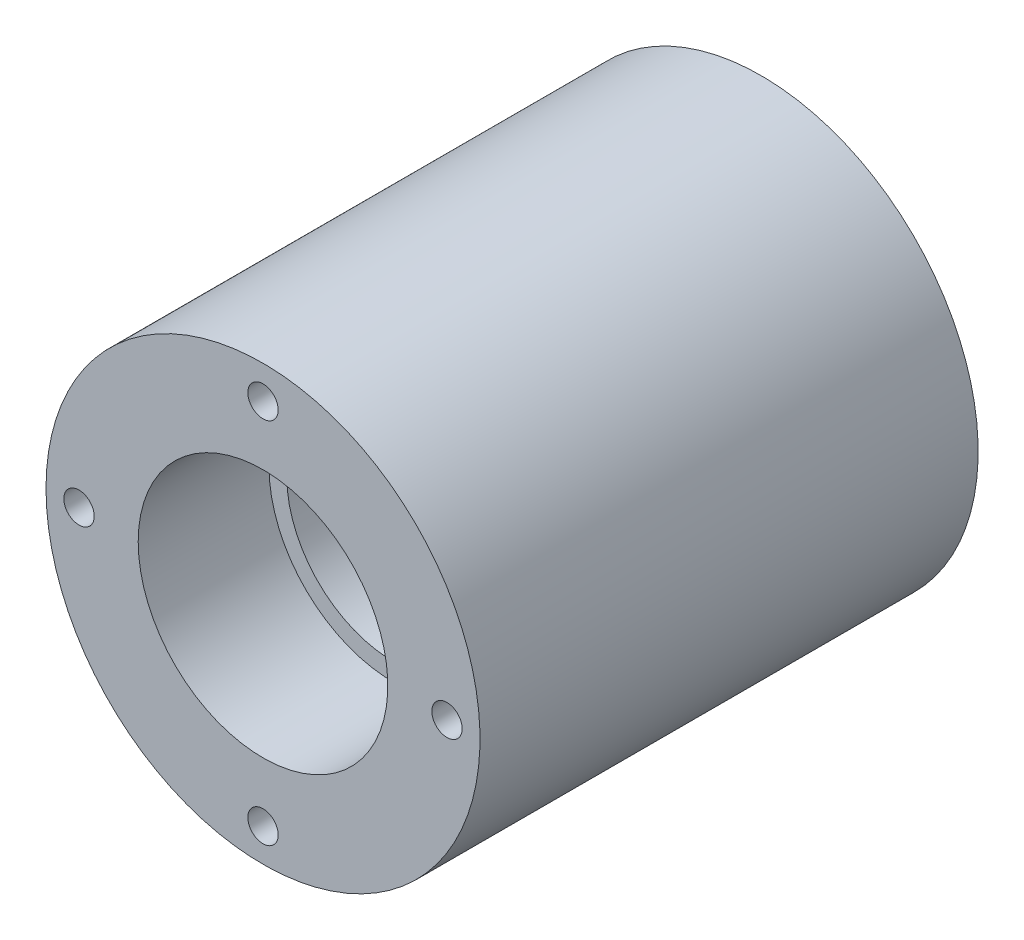
ISO-10303-21;
HEADER;
FILE_DESCRIPTION(('STEP AP214'),'2;1');
FILE_NAME('part.step','',(''),(''),'','','');
FILE_SCHEMA(('AUTOMOTIVE_DESIGN { 1 0 10303 214 1 1 1 1 }'));
ENDSEC;
DATA;
#1=APPLICATION_CONTEXT('core data for automotive mechanical design processes');
#2=APPLICATION_PROTOCOL_DEFINITION('international standard','automotive_design',2000,#1);
#3=PRODUCT_CONTEXT('',#1,'mechanical');
#4=PRODUCT('Part','Part','',(#3));
#5=PRODUCT_RELATED_PRODUCT_CATEGORY('part','',(#4));
#6=PRODUCT_DEFINITION_FORMATION('','',#4);
#7=PRODUCT_DEFINITION_CONTEXT('part definition',#1,'design');
#8=PRODUCT_DEFINITION('design','',#6,#7);
#9=PRODUCT_DEFINITION_SHAPE('','',#8);
#10=(LENGTH_UNIT() NAMED_UNIT(*) SI_UNIT(.MILLI.,.METRE.));
#11=(NAMED_UNIT(*) PLANE_ANGLE_UNIT() SI_UNIT($,.RADIAN.));
#12=(NAMED_UNIT(*) SI_UNIT($,.STERADIAN.) SOLID_ANGLE_UNIT());
#13=UNCERTAINTY_MEASURE_WITH_UNIT(LENGTH_MEASURE(1.E-05),#10,'distance_accuracy_value','');
#14=(GEOMETRIC_REPRESENTATION_CONTEXT(3) GLOBAL_UNCERTAINTY_ASSIGNED_CONTEXT((#13)) GLOBAL_UNIT_ASSIGNED_CONTEXT((#10,
#11,#12)) REPRESENTATION_CONTEXT('',''));
#15=CARTESIAN_POINT('',(0.,0.,0.));
#16=DIRECTION('',(0.,0.,1.));
#17=DIRECTION('',(1.,0.,0.));
#18=AXIS2_PLACEMENT_3D('',#15,#16,#17);
#19=CARTESIAN_POINT('',(0.,0.,-141.552259200278));
#20=DIRECTION('',(0.,0.,-1.));
#21=DIRECTION('',(-1.,0.,0.));
#22=AXIS2_PLACEMENT_3D('',#19,#20,#21);
#23=CYLINDRICAL_SURFACE('',#22,21.);
#24=CARTESIAN_POINT('',(0.,0.,0.));
#25=DIRECTION('',(0.,0.,-1.));
#26=DIRECTION('',(-1.,0.,0.));
#27=AXIS2_PLACEMENT_3D('',#24,#25,#26);
#28=CIRCLE('',#27,21.);
#29=CARTESIAN_POINT('',(-21.,0.,0.));
#30=VERTEX_POINT('',#29);
#31=EDGE_CURVE('E124',#30,#30,#28,.T.);
#32=ORIENTED_EDGE('',*,*,#31,.F.);
#33=EDGE_LOOP('',(#32));
#34=FACE_BOUND('',#33,.T.);
#35=CARTESIAN_POINT('',(0.,0.,-22.));
#36=DIRECTION('',(0.,0.,-1.));
#37=DIRECTION('',(-1.,0.,0.));
#38=AXIS2_PLACEMENT_3D('',#35,#36,#37);
#39=CIRCLE('',#38,21.);
#40=CARTESIAN_POINT('',(-21.,0.,-22.));
#41=VERTEX_POINT('',#40);
#42=EDGE_CURVE('E11',#41,#41,#39,.T.);
#43=ORIENTED_EDGE('',*,*,#42,.T.);
#44=EDGE_LOOP('',(#43));
#45=FACE_BOUND('',#44,.T.);
#46=ADVANCED_FACE('F35',(#34,#45),#23,.F.);
#47=CARTESIAN_POINT('',(0.,0.,-22.));
#48=DIRECTION('',(0.,0.,-1.));
#49=DIRECTION('',(-1.,0.,0.));
#50=AXIS2_PLACEMENT_3D('',#47,#48,#49);
#51=PLANE('',#50);
#52=ORIENTED_EDGE('',*,*,#42,.F.);
#53=EDGE_LOOP('',(#52));
#54=FACE_BOUND('',#53,.T.);
#55=CARTESIAN_POINT('',(0.,0.,-22.));
#56=DIRECTION('',(0.,0.,-1.));
#57=DIRECTION('',(-1.,0.,0.));
#58=AXIS2_PLACEMENT_3D('',#55,#56,#57);
#59=CIRCLE('',#58,18.);
#60=CARTESIAN_POINT('',(-18.,0.,-22.));
#61=VERTEX_POINT('',#60);
#62=EDGE_CURVE('E42',#61,#61,#59,.T.);
#63=ORIENTED_EDGE('',*,*,#62,.T.);
#64=EDGE_LOOP('',(#63));
#65=FACE_BOUND('',#64,.T.);
#66=ADVANCED_FACE('F144',(#54,#65),#51,.F.);
#67=CARTESIAN_POINT('',(0.,0.,-141.552259200278));
#68=DIRECTION('',(0.,0.,-1.));
#69=DIRECTION('',(-1.,0.,0.));
#70=AXIS2_PLACEMENT_3D('',#67,#68,#69);
#71=CYLINDRICAL_SURFACE('',#70,18.);
#72=ORIENTED_EDGE('',*,*,#62,.F.);
#73=EDGE_LOOP('',(#72));
#74=FACE_BOUND('',#73,.T.);
#75=CARTESIAN_POINT('',(0.,0.,-55.945));
#76=DIRECTION('',(0.,0.,-1.));
#77=DIRECTION('',(-1.,0.,0.));
#78=AXIS2_PLACEMENT_3D('',#75,#76,#77);
#79=CIRCLE('',#78,18.);
#80=CARTESIAN_POINT('',(-18.,0.,-55.945));
#81=VERTEX_POINT('',#80);
#82=EDGE_CURVE('E139',#81,#81,#79,.T.);
#83=ORIENTED_EDGE('',*,*,#82,.T.);
#84=EDGE_LOOP('',(#83));
#85=FACE_BOUND('',#84,.T.);
#86=ADVANCED_FACE('F146',(#74,#85),#71,.F.);
#87=CARTESIAN_POINT('',(0.,0.,-55.945));
#88=DIRECTION('',(0.,0.,1.));
#89=DIRECTION('',(1.,0.,0.));
#90=AXIS2_PLACEMENT_3D('',#87,#88,#89);
#91=PLANE('',#90);
#92=ORIENTED_EDGE('',*,*,#82,.F.);
#93=EDGE_LOOP('',(#92));
#94=FACE_BOUND('',#93,.T.);
#95=CARTESIAN_POINT('',(0.,0.,-55.945));
#96=DIRECTION('',(0.,0.,-1.));
#97=DIRECTION('',(-1.,0.,0.));
#98=AXIS2_PLACEMENT_3D('',#95,#96,#97);
#99=CIRCLE('',#98,21.);
#100=CARTESIAN_POINT('',(-21.,0.,-55.945));
#101=VERTEX_POINT('',#100);
#102=EDGE_CURVE('E136',#101,#101,#99,.T.);
#103=ORIENTED_EDGE('',*,*,#102,.T.);
#104=EDGE_LOOP('',(#103));
#105=FACE_BOUND('',#104,.T.);
#106=ADVANCED_FACE('F149',(#94,#105),#91,.F.);
#107=CARTESIAN_POINT('',(0.,0.,-141.552259200278));
#108=DIRECTION('',(0.,0.,-1.));
#109=DIRECTION('',(-1.,0.,0.));
#110=AXIS2_PLACEMENT_3D('',#107,#108,#109);
#111=CYLINDRICAL_SURFACE('',#110,21.);
#112=ORIENTED_EDGE('',*,*,#102,.F.);
#113=EDGE_LOOP('',(#112));
#114=FACE_BOUND('',#113,.T.);
#115=CARTESIAN_POINT('',(0.,0.,-83.82));
#116=DIRECTION('',(0.,0.,-1.));
#117=DIRECTION('',(-1.,0.,0.));
#118=AXIS2_PLACEMENT_3D('',#115,#116,#117);
#119=CIRCLE('',#118,21.);
#120=CARTESIAN_POINT('',(-21.,0.,-83.82));
#121=VERTEX_POINT('',#120);
#122=EDGE_CURVE('E133',#121,#121,#119,.T.);
#123=ORIENTED_EDGE('',*,*,#122,.T.);
#124=EDGE_LOOP('',(#123));
#125=FACE_BOUND('',#124,.T.);
#126=ADVANCED_FACE('F155',(#114,#125),#111,.F.);
#127=CARTESIAN_POINT('',(0.,0.,-83.82));
#128=DIRECTION('',(0.,0.,1.));
#129=DIRECTION('',(1.,0.,0.));
#130=AXIS2_PLACEMENT_3D('',#127,#128,#129);
#131=PLANE('',#130);
#132=CARTESIAN_POINT('',(0.,30.95752,-83.82));
#133=DIRECTION('',(0.,0.,-1.));
#134=DIRECTION('',(-1.,0.,0.));
#135=AXIS2_PLACEMENT_3D('',#132,#133,#134);
#136=CIRCLE('',#135,2.55269999999999);
#137=CARTESIAN_POINT('',(-2.55269999999999,30.95752,-83.82));
#138=VERTEX_POINT('',#137);
#139=EDGE_CURVE('E78',#138,#138,#136,.T.);
#140=ORIENTED_EDGE('',*,*,#139,.F.);
#141=EDGE_LOOP('',(#140));
#142=FACE_BOUND('',#141,.T.);
#143=CARTESIAN_POINT('',(30.95752,0.,-83.82));
#144=DIRECTION('',(0.,0.,-1.));
#145=DIRECTION('',(-1.,0.,0.));
#146=AXIS2_PLACEMENT_3D('',#143,#144,#145);
#147=CIRCLE('',#146,2.55269999999999);
#148=CARTESIAN_POINT('',(28.40482,0.,-83.82));
#149=VERTEX_POINT('',#148);
#150=EDGE_CURVE('E77',#149,#149,#147,.T.);
#151=ORIENTED_EDGE('',*,*,#150,.F.);
#152=EDGE_LOOP('',(#151));
#153=FACE_BOUND('',#152,.T.);
#154=CARTESIAN_POINT('',(0.,-30.95752,-83.82));
#155=DIRECTION('',(0.,0.,-1.));
#156=DIRECTION('',(-1.,0.,0.));
#157=AXIS2_PLACEMENT_3D('',#154,#155,#156);
#158=CIRCLE('',#157,2.55269999999999);
#159=CARTESIAN_POINT('',(-2.55269999999999,-30.95752,-83.82));
#160=VERTEX_POINT('',#159);
#161=EDGE_CURVE('E88',#160,#160,#158,.T.);
#162=ORIENTED_EDGE('',*,*,#161,.F.);
#163=EDGE_LOOP('',(#162));
#164=FACE_BOUND('',#163,.T.);
#165=CARTESIAN_POINT('',(-30.95752,0.,-83.82));
#166=DIRECTION('',(0.,0.,-1.));
#167=DIRECTION('',(-1.,0.,0.));
#168=AXIS2_PLACEMENT_3D('',#165,#166,#167);
#169=CIRCLE('',#168,2.55269999999999);
#170=CARTESIAN_POINT('',(-33.51022,0.,-83.82));
#171=VERTEX_POINT('',#170);
#172=EDGE_CURVE('E94',#171,#171,#169,.T.);
#173=ORIENTED_EDGE('',*,*,#172,.F.);
#174=EDGE_LOOP('',(#173));
#175=FACE_BOUND('',#174,.T.);
#176=ORIENTED_EDGE('',*,*,#122,.F.);
#177=EDGE_LOOP('',(#176));
#178=FACE_BOUND('',#177,.T.);
#179=CARTESIAN_POINT('',(0.,0.,-83.82));
#180=DIRECTION('',(0.,0.,-1.));
#181=DIRECTION('',(-1.,0.,0.));
#182=AXIS2_PLACEMENT_3D('',#179,#180,#181);
#183=CIRCLE('',#182,36.5125);
#184=CARTESIAN_POINT('',(-36.5125,0.,-83.82));
#185=VERTEX_POINT('',#184);
#186=EDGE_CURVE('E130',#185,#185,#183,.T.);
#187=ORIENTED_EDGE('',*,*,#186,.T.);
#188=EDGE_LOOP('',(#187));
#189=FACE_BOUND('',#188,.T.);
#190=ADVANCED_FACE('F161',(#142,#153,#164,#175,#178,#189),#131,.F.);
#191=CARTESIAN_POINT('',(0.,0.,-141.552259200278));
#192=DIRECTION('',(0.,0.,-1.));
#193=DIRECTION('',(-1.,0.,0.));
#194=AXIS2_PLACEMENT_3D('',#191,#192,#193);
#195=CYLINDRICAL_SURFACE('',#194,36.5125);
#196=CARTESIAN_POINT('',(0.,0.,0.));
#197=DIRECTION('',(0.,0.,-1.));
#198=DIRECTION('',(-1.,0.,0.));
#199=AXIS2_PLACEMENT_3D('',#196,#197,#198);
#200=CIRCLE('',#199,36.5125);
#201=CARTESIAN_POINT('',(-36.5125,0.,0.));
#202=VERTEX_POINT('',#201);
#203=EDGE_CURVE('E127',#202,#202,#200,.T.);
#204=ORIENTED_EDGE('',*,*,#203,.T.);
#205=EDGE_LOOP('',(#204));
#206=FACE_BOUND('',#205,.T.);
#207=ORIENTED_EDGE('',*,*,#186,.F.);
#208=EDGE_LOOP('',(#207));
#209=FACE_BOUND('',#208,.T.);
#210=ADVANCED_FACE('F167',(#206,#209),#195,.T.);
#211=CARTESIAN_POINT('',(0.,0.,0.));
#212=DIRECTION('',(0.,0.,1.));
#213=DIRECTION('',(1.,0.,0.));
#214=AXIS2_PLACEMENT_3D('',#211,#212,#213);
#215=PLANE('',#214);
#216=CARTESIAN_POINT('',(0.,30.95752,0.));
#217=DIRECTION('',(0.,0.,1.));
#218=DIRECTION('',(1.,0.,0.));
#219=AXIS2_PLACEMENT_3D('',#216,#217,#218);
#220=CIRCLE('',#219,2.55269999999999);
#221=CARTESIAN_POINT('',(2.55269999999999,30.95752,0.));
#222=VERTEX_POINT('',#221);
#223=EDGE_CURVE('E100',#222,#222,#220,.T.);
#224=ORIENTED_EDGE('',*,*,#223,.F.);
#225=EDGE_LOOP('',(#224));
#226=FACE_BOUND('',#225,.T.);
#227=CARTESIAN_POINT('',(30.95752,0.,0.));
#228=DIRECTION('',(0.,0.,1.));
#229=DIRECTION('',(1.,0.,0.));
#230=AXIS2_PLACEMENT_3D('',#227,#228,#229);
#231=CIRCLE('',#230,2.55269999999999);
#232=CARTESIAN_POINT('',(33.51022,0.,0.));
#233=VERTEX_POINT('',#232);
#234=EDGE_CURVE('E106',#233,#233,#231,.T.);
#235=ORIENTED_EDGE('',*,*,#234,.F.);
#236=EDGE_LOOP('',(#235));
#237=FACE_BOUND('',#236,.T.);
#238=CARTESIAN_POINT('',(0.,-30.95752,0.));
#239=DIRECTION('',(0.,0.,1.));
#240=DIRECTION('',(1.,0.,0.));
#241=AXIS2_PLACEMENT_3D('',#238,#239,#240);
#242=CIRCLE('',#241,2.55269999999999);
#243=CARTESIAN_POINT('',(2.55269999999999,-30.95752,0.));
#244=VERTEX_POINT('',#243);
#245=EDGE_CURVE('E112',#244,#244,#242,.T.);
#246=ORIENTED_EDGE('',*,*,#245,.F.);
#247=EDGE_LOOP('',(#246));
#248=FACE_BOUND('',#247,.T.);
#249=CARTESIAN_POINT('',(-30.95752,0.,0.));
#250=DIRECTION('',(0.,0.,1.));
#251=DIRECTION('',(1.,0.,0.));
#252=AXIS2_PLACEMENT_3D('',#249,#250,#251);
#253=CIRCLE('',#252,2.55269999999999);
#254=CARTESIAN_POINT('',(-28.40482,0.,0.));
#255=VERTEX_POINT('',#254);
#256=EDGE_CURVE('E118',#255,#255,#253,.T.);
#257=ORIENTED_EDGE('',*,*,#256,.F.);
#258=EDGE_LOOP('',(#257));
#259=FACE_BOUND('',#258,.T.);
#260=ORIENTED_EDGE('',*,*,#31,.T.);
#261=EDGE_LOOP('',(#260));
#262=FACE_BOUND('',#261,.T.);
#263=ORIENTED_EDGE('',*,*,#203,.F.);
#264=EDGE_LOOP('',(#263));
#265=FACE_BOUND('',#264,.T.);
#266=ADVANCED_FACE('F173',(#226,#237,#248,#259,#262,#265),#215,.T.);
#267=CARTESIAN_POINT('',(-30.95752,0.,-12.7));
#268=DIRECTION('',(0.,0.,1.));
#269=DIRECTION('',(1.,0.,0.));
#270=AXIS2_PLACEMENT_3D('',#267,#268,#269);
#271=CONICAL_SURFACE('',#270,2.5527,1.02974425867665);
#272=CARTESIAN_POINT('',(-30.95752,0.,-14.2338169021917));
#273=VERTEX_POINT('',#272);
#274=VERTEX_LOOP('',#273);
#275=FACE_BOUND('',#274,.T.);
#276=CARTESIAN_POINT('',(-30.95752,0.,-12.7));
#277=DIRECTION('',(0.,0.,1.));
#278=DIRECTION('',(1.,0.,0.));
#279=AXIS2_PLACEMENT_3D('',#276,#277,#278);
#280=CIRCLE('',#279,2.5527);
#281=CARTESIAN_POINT('',(-28.40482,0.,-12.7));
#282=VERTEX_POINT('',#281);
#283=EDGE_CURVE('E121',#282,#282,#280,.T.);
#284=ORIENTED_EDGE('',*,*,#283,.T.);
#285=EDGE_LOOP('',(#284));
#286=FACE_BOUND('',#285,.T.);
#287=ADVANCED_FACE('F179',(#275,#286),#271,.F.);
#288=CARTESIAN_POINT('',(-30.95752,0.,0.));
#289=DIRECTION('',(0.,0.,1.));
#290=DIRECTION('',(1.,0.,0.));
#291=AXIS2_PLACEMENT_3D('',#288,#289,#290);
#292=CYLINDRICAL_SURFACE('',#291,2.55269999999999);
#293=ORIENTED_EDGE('',*,*,#283,.F.);
#294=EDGE_LOOP('',(#293));
#295=FACE_BOUND('',#294,.T.);
#296=ORIENTED_EDGE('',*,*,#256,.T.);
#297=EDGE_LOOP('',(#296));
#298=FACE_BOUND('',#297,.T.);
#299=ADVANCED_FACE('F319',(#295,#298),#292,.F.);
#300=CARTESIAN_POINT('',(0.,-30.95752,-12.7));
#301=DIRECTION('',(0.,0.,1.));
#302=DIRECTION('',(1.,0.,0.));
#303=AXIS2_PLACEMENT_3D('',#300,#301,#302);
#304=CONICAL_SURFACE('',#303,2.5527,1.02974425867665);
#305=CARTESIAN_POINT('',(0.,-30.95752,-14.2338169021917));
#306=VERTEX_POINT('',#305);
#307=VERTEX_LOOP('',#306);
#308=FACE_BOUND('',#307,.T.);
#309=CARTESIAN_POINT('',(0.,-30.95752,-12.7));
#310=DIRECTION('',(0.,0.,1.));
#311=DIRECTION('',(1.,0.,0.));
#312=AXIS2_PLACEMENT_3D('',#309,#310,#311);
#313=CIRCLE('',#312,2.5527);
#314=CARTESIAN_POINT('',(2.5527,-30.95752,-12.7));
#315=VERTEX_POINT('',#314);
#316=EDGE_CURVE('E115',#315,#315,#313,.T.);
#317=ORIENTED_EDGE('',*,*,#316,.T.);
#318=EDGE_LOOP('',(#317));
#319=FACE_BOUND('',#318,.T.);
#320=ADVANCED_FACE('F315',(#308,#319),#304,.F.);
#321=CARTESIAN_POINT('',(0.,-30.95752,0.));
#322=DIRECTION('',(0.,0.,1.));
#323=DIRECTION('',(1.,0.,0.));
#324=AXIS2_PLACEMENT_3D('',#321,#322,#323);
#325=CYLINDRICAL_SURFACE('',#324,2.55269999999999);
#326=ORIENTED_EDGE('',*,*,#316,.F.);
#327=EDGE_LOOP('',(#326));
#328=FACE_BOUND('',#327,.T.);
#329=ORIENTED_EDGE('',*,*,#245,.T.);
#330=EDGE_LOOP('',(#329));
#331=FACE_BOUND('',#330,.T.);
#332=ADVANCED_FACE('F311',(#328,#331),#325,.F.);
#333=CARTESIAN_POINT('',(30.95752,0.,-12.7));
#334=DIRECTION('',(0.,0.,1.));
#335=DIRECTION('',(1.,0.,0.));
#336=AXIS2_PLACEMENT_3D('',#333,#334,#335);
#337=CONICAL_SURFACE('',#336,2.5527,1.02974425867665);
#338=CARTESIAN_POINT('',(30.95752,0.,-14.2338169021917));
#339=VERTEX_POINT('',#338);
#340=VERTEX_LOOP('',#339);
#341=FACE_BOUND('',#340,.T.);
#342=CARTESIAN_POINT('',(30.95752,0.,-12.7));
#343=DIRECTION('',(0.,0.,1.));
#344=DIRECTION('',(1.,0.,0.));
#345=AXIS2_PLACEMENT_3D('',#342,#343,#344);
#346=CIRCLE('',#345,2.5527);
#347=CARTESIAN_POINT('',(33.51022,0.,-12.7));
#348=VERTEX_POINT('',#347);
#349=EDGE_CURVE('E109',#348,#348,#346,.T.);
#350=ORIENTED_EDGE('',*,*,#349,.T.);
#351=EDGE_LOOP('',(#350));
#352=FACE_BOUND('',#351,.T.);
#353=ADVANCED_FACE('F307',(#341,#352),#337,.F.);
#354=CARTESIAN_POINT('',(30.95752,0.,0.));
#355=DIRECTION('',(0.,0.,1.));
#356=DIRECTION('',(1.,0.,0.));
#357=AXIS2_PLACEMENT_3D('',#354,#355,#356);
#358=CYLINDRICAL_SURFACE('',#357,2.55269999999999);
#359=ORIENTED_EDGE('',*,*,#349,.F.);
#360=EDGE_LOOP('',(#359));
#361=FACE_BOUND('',#360,.T.);
#362=ORIENTED_EDGE('',*,*,#234,.T.);
#363=EDGE_LOOP('',(#362));
#364=FACE_BOUND('',#363,.T.);
#365=ADVANCED_FACE('F303',(#361,#364),#358,.F.);
#366=CARTESIAN_POINT('',(0.,30.95752,-12.7));
#367=DIRECTION('',(0.,0.,1.));
#368=DIRECTION('',(1.,0.,0.));
#369=AXIS2_PLACEMENT_3D('',#366,#367,#368);
#370=CONICAL_SURFACE('',#369,2.5527,1.02974425867665);
#371=CARTESIAN_POINT('',(0.,30.95752,-14.2338169021917));
#372=VERTEX_POINT('',#371);
#373=VERTEX_LOOP('',#372);
#374=FACE_BOUND('',#373,.T.);
#375=CARTESIAN_POINT('',(0.,30.95752,-12.7));
#376=DIRECTION('',(0.,0.,1.));
#377=DIRECTION('',(1.,0.,0.));
#378=AXIS2_PLACEMENT_3D('',#375,#376,#377);
#379=CIRCLE('',#378,2.5527);
#380=CARTESIAN_POINT('',(2.5527,30.95752,-12.7));
#381=VERTEX_POINT('',#380);
#382=EDGE_CURVE('E103',#381,#381,#379,.T.);
#383=ORIENTED_EDGE('',*,*,#382,.T.);
#384=EDGE_LOOP('',(#383));
#385=FACE_BOUND('',#384,.T.);
#386=ADVANCED_FACE('F299',(#374,#385),#370,.F.);
#387=CARTESIAN_POINT('',(0.,30.95752,0.));
#388=DIRECTION('',(0.,0.,1.));
#389=DIRECTION('',(1.,0.,0.));
#390=AXIS2_PLACEMENT_3D('',#387,#388,#389);
#391=CYLINDRICAL_SURFACE('',#390,2.55269999999999);
#392=ORIENTED_EDGE('',*,*,#382,.F.);
#393=EDGE_LOOP('',(#392));
#394=FACE_BOUND('',#393,.T.);
#395=ORIENTED_EDGE('',*,*,#223,.T.);
#396=EDGE_LOOP('',(#395));
#397=FACE_BOUND('',#396,.T.);
#398=ADVANCED_FACE('F219',(#394,#397),#391,.F.);
#399=CARTESIAN_POINT('',(-30.95752,0.,-71.12));
#400=DIRECTION('',(0.,0.,-1.));
#401=DIRECTION('',(-1.,0.,0.));
#402=AXIS2_PLACEMENT_3D('',#399,#400,#401);
#403=CONICAL_SURFACE('',#402,2.5527,1.02974425867665);
#404=CARTESIAN_POINT('',(-30.95752,0.,-69.5861830978083));
#405=VERTEX_POINT('',#404);
#406=VERTEX_LOOP('',#405);
#407=FACE_BOUND('',#406,.T.);
#408=CARTESIAN_POINT('',(-30.95752,0.,-71.12));
#409=DIRECTION('',(0.,0.,-1.));
#410=DIRECTION('',(-1.,0.,0.));
#411=AXIS2_PLACEMENT_3D('',#408,#409,#410);
#412=CIRCLE('',#411,2.5527);
#413=CARTESIAN_POINT('',(-33.51022,0.,-71.12));
#414=VERTEX_POINT('',#413);
#415=EDGE_CURVE('E97',#414,#414,#412,.T.);
#416=ORIENTED_EDGE('',*,*,#415,.T.);
#417=EDGE_LOOP('',(#416));
#418=FACE_BOUND('',#417,.T.);
#419=ADVANCED_FACE('F224',(#407,#418),#403,.F.);
#420=CARTESIAN_POINT('',(-30.95752,0.,-83.82));
#421=DIRECTION('',(0.,0.,-1.));
#422=DIRECTION('',(-1.,0.,0.));
#423=AXIS2_PLACEMENT_3D('',#420,#421,#422);
#424=CYLINDRICAL_SURFACE('',#423,2.55269999999999);
#425=ORIENTED_EDGE('',*,*,#415,.F.);
#426=EDGE_LOOP('',(#425));
#427=FACE_BOUND('',#426,.T.);
#428=ORIENTED_EDGE('',*,*,#172,.T.);
#429=EDGE_LOOP('',(#428));
#430=FACE_BOUND('',#429,.T.);
#431=ADVANCED_FACE('F229',(#427,#430),#424,.F.);
#432=CARTESIAN_POINT('',(0.,-30.95752,-71.12));
#433=DIRECTION('',(0.,0.,-1.));
#434=DIRECTION('',(-1.,0.,0.));
#435=AXIS2_PLACEMENT_3D('',#432,#433,#434);
#436=CONICAL_SURFACE('',#435,2.5527,1.02974425867665);
#437=CARTESIAN_POINT('',(0.,-30.95752,-69.5861830978083));
#438=VERTEX_POINT('',#437);
#439=VERTEX_LOOP('',#438);
#440=FACE_BOUND('',#439,.T.);
#441=CARTESIAN_POINT('',(0.,-30.95752,-71.12));
#442=DIRECTION('',(0.,0.,-1.));
#443=DIRECTION('',(-1.,0.,0.));
#444=AXIS2_PLACEMENT_3D('',#441,#442,#443);
#445=CIRCLE('',#444,2.5527);
#446=CARTESIAN_POINT('',(-2.5527,-30.95752,-71.12));
#447=VERTEX_POINT('',#446);
#448=EDGE_CURVE('E91',#447,#447,#445,.T.);
#449=ORIENTED_EDGE('',*,*,#448,.T.);
#450=EDGE_LOOP('',(#449));
#451=FACE_BOUND('',#450,.T.);
#452=ADVANCED_FACE('F239',(#440,#451),#436,.F.);
#453=CARTESIAN_POINT('',(0.,-30.95752,-83.82));
#454=DIRECTION('',(0.,0.,-1.));
#455=DIRECTION('',(-1.,0.,0.));
#456=AXIS2_PLACEMENT_3D('',#453,#454,#455);
#457=CYLINDRICAL_SURFACE('',#456,2.55269999999999);
#458=ORIENTED_EDGE('',*,*,#448,.F.);
#459=EDGE_LOOP('',(#458));
#460=FACE_BOUND('',#459,.T.);
#461=ORIENTED_EDGE('',*,*,#161,.T.);
#462=EDGE_LOOP('',(#461));
#463=FACE_BOUND('',#462,.T.);
#464=ADVANCED_FACE('F249',(#460,#463),#457,.F.);
#465=CARTESIAN_POINT('',(30.95752,0.,-71.12));
#466=DIRECTION('',(0.,0.,-1.));
#467=DIRECTION('',(-1.,0.,0.));
#468=AXIS2_PLACEMENT_3D('',#465,#466,#467);
#469=CONICAL_SURFACE('',#468,2.5527,1.02974425867665);
#470=CARTESIAN_POINT('',(30.95752,0.,-69.5861830978083));
#471=VERTEX_POINT('',#470);
#472=VERTEX_LOOP('',#471);
#473=FACE_BOUND('',#472,.T.);
#474=CARTESIAN_POINT('',(30.95752,0.,-71.12));
#475=DIRECTION('',(0.,0.,-1.));
#476=DIRECTION('',(-1.,0.,0.));
#477=AXIS2_PLACEMENT_3D('',#474,#475,#476);
#478=CIRCLE('',#477,2.5527);
#479=CARTESIAN_POINT('',(28.40482,0.,-71.12));
#480=VERTEX_POINT('',#479);
#481=EDGE_CURVE('E81',#480,#480,#478,.T.);
#482=ORIENTED_EDGE('',*,*,#481,.T.);
#483=EDGE_LOOP('',(#482));
#484=FACE_BOUND('',#483,.T.);
#485=ADVANCED_FACE('F259',(#473,#484),#469,.F.);
#486=CARTESIAN_POINT('',(30.95752,0.,-83.82));
#487=DIRECTION('',(0.,0.,-1.));
#488=DIRECTION('',(-1.,0.,0.));
#489=AXIS2_PLACEMENT_3D('',#486,#487,#488);
#490=CYLINDRICAL_SURFACE('',#489,2.55269999999999);
#491=ORIENTED_EDGE('',*,*,#481,.F.);
#492=EDGE_LOOP('',(#491));
#493=FACE_BOUND('',#492,.T.);
#494=ORIENTED_EDGE('',*,*,#150,.T.);
#495=EDGE_LOOP('',(#494));
#496=FACE_BOUND('',#495,.T.);
#497=ADVANCED_FACE('F71',(#493,#496),#490,.F.);
#498=CARTESIAN_POINT('',(0.,30.95752,-71.12));
#499=DIRECTION('',(0.,0.,-1.));
#500=DIRECTION('',(-1.,0.,0.));
#501=AXIS2_PLACEMENT_3D('',#498,#499,#500);
#502=CONICAL_SURFACE('',#501,2.5527,1.02974425867665);
#503=CARTESIAN_POINT('',(0.,30.95752,-69.5861830978083));
#504=VERTEX_POINT('',#503);
#505=VERTEX_LOOP('',#504);
#506=FACE_BOUND('',#505,.T.);
#507=CARTESIAN_POINT('',(0.,30.95752,-71.12));
#508=DIRECTION('',(0.,0.,-1.));
#509=DIRECTION('',(-1.,0.,0.));
#510=AXIS2_PLACEMENT_3D('',#507,#508,#509);
#511=CIRCLE('',#510,2.5527);
#512=CARTESIAN_POINT('',(-2.5527,30.95752,-71.12));
#513=VERTEX_POINT('',#512);
#514=EDGE_CURVE('E75',#513,#513,#511,.T.);
#515=ORIENTED_EDGE('',*,*,#514,.T.);
#516=EDGE_LOOP('',(#515));
#517=FACE_BOUND('',#516,.T.);
#518=ADVANCED_FACE('F67',(#506,#517),#502,.F.);
#519=CARTESIAN_POINT('',(0.,30.95752,-83.82));
#520=DIRECTION('',(0.,0.,-1.));
#521=DIRECTION('',(-1.,0.,0.));
#522=AXIS2_PLACEMENT_3D('',#519,#520,#521);
#523=CYLINDRICAL_SURFACE('',#522,2.55269999999999);
#524=ORIENTED_EDGE('',*,*,#514,.F.);
#525=EDGE_LOOP('',(#524));
#526=FACE_BOUND('',#525,.T.);
#527=ORIENTED_EDGE('',*,*,#139,.T.);
#528=EDGE_LOOP('',(#527));
#529=FACE_BOUND('',#528,.T.);
#530=ADVANCED_FACE('F70',(#526,#529),#523,.F.);
#531=CLOSED_SHELL('',(#46,#66,#86,#106,#126,#190,#210,#266,#287,#299,#320,#332,#353,#365,#386,
#398,#419,#431,#452,#464,#485,#497,#518,#530));
#532=MANIFOLD_SOLID_BREP('B2',#531);
#533=ADVANCED_BREP_SHAPE_REPRESENTATION('',(#18,#532),#14);
#534=SHAPE_DEFINITION_REPRESENTATION(#9,#533);
ENDSEC;
END-ISO-10303-21;
